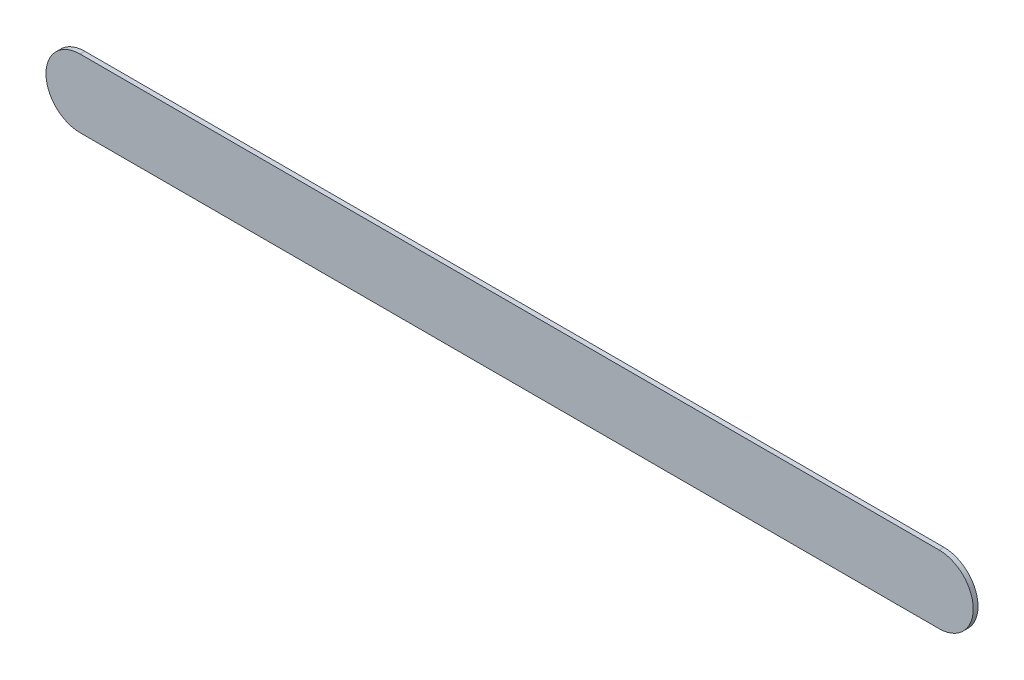
ISO-10303-21;
HEADER;
FILE_DESCRIPTION(('STEP AP214'),'2;1');
FILE_NAME('part.step','',(''),(''),'','','');
FILE_SCHEMA(('AUTOMOTIVE_DESIGN { 1 0 10303 214 1 1 1 1 }'));
ENDSEC;
DATA;
#1=APPLICATION_CONTEXT('core data for automotive mechanical design processes');
#2=APPLICATION_PROTOCOL_DEFINITION('international standard','automotive_design',2000,#1);
#3=PRODUCT_CONTEXT('',#1,'mechanical');
#4=PRODUCT('Part','Part','',(#3));
#5=PRODUCT_RELATED_PRODUCT_CATEGORY('part','',(#4));
#6=PRODUCT_DEFINITION_FORMATION('','',#4);
#7=PRODUCT_DEFINITION_CONTEXT('part definition',#1,'design');
#8=PRODUCT_DEFINITION('design','',#6,#7);
#9=PRODUCT_DEFINITION_SHAPE('','',#8);
#10=(LENGTH_UNIT() NAMED_UNIT(*) SI_UNIT(.MILLI.,.METRE.));
#11=(NAMED_UNIT(*) PLANE_ANGLE_UNIT() SI_UNIT($,.RADIAN.));
#12=(NAMED_UNIT(*) SI_UNIT($,.STERADIAN.) SOLID_ANGLE_UNIT());
#13=UNCERTAINTY_MEASURE_WITH_UNIT(LENGTH_MEASURE(1.E-05),#10,'distance_accuracy_value','');
#14=(GEOMETRIC_REPRESENTATION_CONTEXT(3) GLOBAL_UNCERTAINTY_ASSIGNED_CONTEXT((#13)) GLOBAL_UNIT_ASSIGNED_CONTEXT((#10,
#11,#12)) REPRESENTATION_CONTEXT('',''));
#15=CARTESIAN_POINT('',(0.,0.,0.));
#16=DIRECTION('',(0.,0.,1.));
#17=DIRECTION('',(1.,0.,0.));
#18=AXIS2_PLACEMENT_3D('',#15,#16,#17);
#19=CARTESIAN_POINT('',(91.42,-84.95,1.635));
#20=DIRECTION('',(0.,0.,1.));
#21=DIRECTION('',(1.,0.,0.));
#22=AXIS2_PLACEMENT_3D('',#19,#20,#21);
#23=PLANE('',#22);
#24=DIRECTION('',(1.,0.,0.));
#25=VECTOR('',#24,1.);
#26=CARTESIAN_POINT('',(91.42,-84.95,1.635));
#27=LINE('',#26,#25);
#28=CARTESIAN_POINT('',(91.42,-84.95,1.635));
#29=VERTEX_POINT('',#28);
#30=CARTESIAN_POINT('',(97.72,-84.95,1.635));
#31=VERTEX_POINT('',#30);
#32=EDGE_CURVE('E84',#29,#31,#27,.T.);
#33=ORIENTED_EDGE('',*,*,#32,.T.);
#34=CARTESIAN_POINT('',(97.72,-84.7,1.635));
#35=DIRECTION('',(0.,0.,1.));
#36=DIRECTION('',(0.,-1.,0.));
#37=AXIS2_PLACEMENT_3D('',#34,#35,#36);
#38=CIRCLE('',#37,0.25);
#39=CARTESIAN_POINT('',(97.72,-84.45,1.635));
#40=VERTEX_POINT('',#39);
#41=EDGE_CURVE('E103',#31,#40,#38,.T.);
#42=ORIENTED_EDGE('',*,*,#41,.T.);
#43=DIRECTION('',(-1.,0.,0.));
#44=VECTOR('',#43,1.);
#45=CARTESIAN_POINT('',(97.72,-84.45,1.635));
#46=LINE('',#45,#44);
#47=CARTESIAN_POINT('',(91.42,-84.45,1.635));
#48=VERTEX_POINT('',#47);
#49=EDGE_CURVE('E21',#40,#48,#46,.T.);
#50=ORIENTED_EDGE('',*,*,#49,.T.);
#51=CARTESIAN_POINT('',(91.42,-84.7,1.635));
#52=DIRECTION('',(0.,0.,1.));
#53=DIRECTION('',(0.,1.,0.));
#54=AXIS2_PLACEMENT_3D('',#51,#52,#53);
#55=CIRCLE('',#54,0.25);
#56=EDGE_CURVE('E11',#48,#29,#55,.T.);
#57=ORIENTED_EDGE('',*,*,#56,.T.);
#58=EDGE_LOOP('',(#33,#42,#50,#57));
#59=FACE_BOUND('',#58,.T.);
#60=ADVANCED_FACE('F17',(#59),#23,.T.);
#61=CARTESIAN_POINT('',(91.42,-84.95,1.6));
#62=DIRECTION('',(0.,0.,1.));
#63=DIRECTION('',(1.,0.,0.));
#64=AXIS2_PLACEMENT_3D('',#61,#62,#63);
#65=PLANE('',#64);
#66=CARTESIAN_POINT('',(91.42,-84.7,1.6));
#67=DIRECTION('',(0.,0.,1.));
#68=DIRECTION('',(0.,1.,0.));
#69=AXIS2_PLACEMENT_3D('',#66,#67,#68);
#70=CIRCLE('',#69,0.25);
#71=CARTESIAN_POINT('',(91.42,-84.45,1.6));
#72=VERTEX_POINT('',#71);
#73=CARTESIAN_POINT('',(91.42,-84.95,1.6));
#74=VERTEX_POINT('',#73);
#75=EDGE_CURVE('E27',#72,#74,#70,.T.);
#76=ORIENTED_EDGE('',*,*,#75,.F.);
#77=DIRECTION('',(-1.,0.,0.));
#78=VECTOR('',#77,1.);
#79=CARTESIAN_POINT('',(97.72,-84.45,1.6));
#80=LINE('',#79,#78);
#81=CARTESIAN_POINT('',(97.72,-84.45,1.6));
#82=VERTEX_POINT('',#81);
#83=EDGE_CURVE('E110',#82,#72,#80,.T.);
#84=ORIENTED_EDGE('',*,*,#83,.F.);
#85=CARTESIAN_POINT('',(97.72,-84.7,1.6));
#86=DIRECTION('',(0.,0.,1.));
#87=DIRECTION('',(0.,-1.,0.));
#88=AXIS2_PLACEMENT_3D('',#85,#86,#87);
#89=CIRCLE('',#88,0.25);
#90=CARTESIAN_POINT('',(97.72,-84.95,1.6));
#91=VERTEX_POINT('',#90);
#92=EDGE_CURVE('E86',#91,#82,#89,.T.);
#93=ORIENTED_EDGE('',*,*,#92,.F.);
#94=DIRECTION('',(1.,0.,0.));
#95=VECTOR('',#94,1.);
#96=CARTESIAN_POINT('',(91.42,-84.95,1.6));
#97=LINE('',#96,#95);
#98=EDGE_CURVE('E82',#74,#91,#97,.T.);
#99=ORIENTED_EDGE('',*,*,#98,.F.);
#100=EDGE_LOOP('',(#76,#84,#93,#99));
#101=FACE_BOUND('',#100,.T.);
#102=ADVANCED_FACE('F19',(#101),#65,.F.);
#103=CARTESIAN_POINT('',(91.42,-84.7,1.6));
#104=DIRECTION('',(0.,0.,-1.));
#105=DIRECTION('',(0.,1.,0.));
#106=AXIS2_PLACEMENT_3D('',#103,#104,#105);
#107=CYLINDRICAL_SURFACE('',#106,0.25);
#108=ORIENTED_EDGE('',*,*,#75,.T.);
#109=DIRECTION('',(0.,0.,1.));
#110=VECTOR('',#109,1.);
#111=CARTESIAN_POINT('',(91.42,-84.95,1.6));
#112=LINE('',#111,#110);
#113=EDGE_CURVE('E71',#74,#29,#112,.T.);
#114=ORIENTED_EDGE('',*,*,#113,.T.);
#115=ORIENTED_EDGE('',*,*,#56,.F.);
#116=DIRECTION('',(0.,0.,1.));
#117=VECTOR('',#116,1.);
#118=CARTESIAN_POINT('',(91.42,-84.45,1.6));
#119=LINE('',#118,#117);
#120=EDGE_CURVE('E74',#72,#48,#119,.T.);
#121=ORIENTED_EDGE('',*,*,#120,.F.);
#122=EDGE_LOOP('',(#108,#114,#115,#121));
#123=FACE_BOUND('',#122,.T.);
#124=ADVANCED_FACE('F70',(#123),#107,.T.);
#125=CARTESIAN_POINT('',(97.72,-84.45,1.6));
#126=DIRECTION('',(0.,-1.,0.));
#127=DIRECTION('',(0.,0.,-1.));
#128=AXIS2_PLACEMENT_3D('',#125,#126,#127);
#129=PLANE('',#128);
#130=ORIENTED_EDGE('',*,*,#83,.T.);
#131=ORIENTED_EDGE('',*,*,#120,.T.);
#132=ORIENTED_EDGE('',*,*,#49,.F.);
#133=DIRECTION('',(0.,0.,1.));
#134=VECTOR('',#133,1.);
#135=CARTESIAN_POINT('',(97.72,-84.45,1.6));
#136=LINE('',#135,#134);
#137=EDGE_CURVE('E99',#82,#40,#136,.T.);
#138=ORIENTED_EDGE('',*,*,#137,.F.);
#139=EDGE_LOOP('',(#130,#131,#132,#138));
#140=FACE_BOUND('',#139,.T.);
#141=ADVANCED_FACE('F122',(#140),#129,.F.);
#142=CARTESIAN_POINT('',(97.72,-84.7,1.6));
#143=DIRECTION('',(0.,0.,-1.));
#144=DIRECTION('',(0.,-1.,0.));
#145=AXIS2_PLACEMENT_3D('',#142,#143,#144);
#146=CYLINDRICAL_SURFACE('',#145,0.25);
#147=ORIENTED_EDGE('',*,*,#92,.T.);
#148=ORIENTED_EDGE('',*,*,#137,.T.);
#149=ORIENTED_EDGE('',*,*,#41,.F.);
#150=DIRECTION('',(0.,0.,1.));
#151=VECTOR('',#150,1.);
#152=CARTESIAN_POINT('',(97.72,-84.95,1.6));
#153=LINE('',#152,#151);
#154=EDGE_CURVE('E91',#91,#31,#153,.T.);
#155=ORIENTED_EDGE('',*,*,#154,.F.);
#156=EDGE_LOOP('',(#147,#148,#149,#155));
#157=FACE_BOUND('',#156,.T.);
#158=ADVANCED_FACE('F124',(#157),#146,.T.);
#159=CARTESIAN_POINT('',(91.42,-84.95,1.6));
#160=DIRECTION('',(0.,1.,0.));
#161=DIRECTION('',(1.,0.,0.));
#162=AXIS2_PLACEMENT_3D('',#159,#160,#161);
#163=PLANE('',#162);
#164=ORIENTED_EDGE('',*,*,#98,.T.);
#165=ORIENTED_EDGE('',*,*,#154,.T.);
#166=ORIENTED_EDGE('',*,*,#32,.F.);
#167=ORIENTED_EDGE('',*,*,#113,.F.);
#168=EDGE_LOOP('',(#164,#165,#166,#167));
#169=FACE_BOUND('',#168,.T.);
#170=ADVANCED_FACE('F80',(#169),#163,.F.);
#171=CLOSED_SHELL('',(#60,#102,#124,#141,#158,#170));
#172=MANIFOLD_SOLID_BREP('B1',#171);
#173=ADVANCED_BREP_SHAPE_REPRESENTATION('',(#18,#172),#14);
#174=SHAPE_DEFINITION_REPRESENTATION(#9,#173);
ENDSEC;
END-ISO-10303-21;
